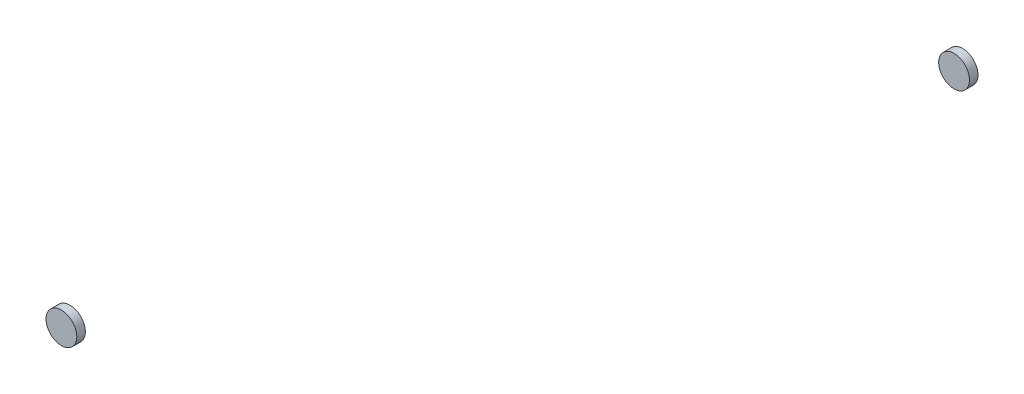
ISO-10303-21;
HEADER;
FILE_DESCRIPTION(('STEP AP214'),'2;1');
FILE_NAME('part.step','',(''),(''),'','','');
FILE_SCHEMA(('AUTOMOTIVE_DESIGN { 1 0 10303 214 1 1 1 1 }'));
ENDSEC;
DATA;
#1=APPLICATION_CONTEXT('core data for automotive mechanical design processes');
#2=APPLICATION_PROTOCOL_DEFINITION('international standard','automotive_design',2000,#1);
#3=PRODUCT_CONTEXT('',#1,'mechanical');
#4=PRODUCT('Part','Part','',(#3));
#5=PRODUCT_RELATED_PRODUCT_CATEGORY('part','',(#4));
#6=PRODUCT_DEFINITION_FORMATION('','',#4);
#7=PRODUCT_DEFINITION_CONTEXT('part definition',#1,'design');
#8=PRODUCT_DEFINITION('design','',#6,#7);
#9=PRODUCT_DEFINITION_SHAPE('','',#8);
#10=(LENGTH_UNIT() NAMED_UNIT(*) SI_UNIT(.MILLI.,.METRE.));
#11=(NAMED_UNIT(*) PLANE_ANGLE_UNIT() SI_UNIT($,.RADIAN.));
#12=(NAMED_UNIT(*) SI_UNIT($,.STERADIAN.) SOLID_ANGLE_UNIT());
#13=UNCERTAINTY_MEASURE_WITH_UNIT(LENGTH_MEASURE(1.E-05),#10,'distance_accuracy_value','');
#14=(GEOMETRIC_REPRESENTATION_CONTEXT(3) GLOBAL_UNCERTAINTY_ASSIGNED_CONTEXT((#13)) GLOBAL_UNIT_ASSIGNED_CONTEXT((#10,
#11,#12)) REPRESENTATION_CONTEXT('',''));
#15=CARTESIAN_POINT('',(0.,0.,0.));
#16=DIRECTION('',(0.,0.,1.));
#17=DIRECTION('',(1.,0.,0.));
#18=AXIS2_PLACEMENT_3D('',#15,#16,#17);
#19=CARTESIAN_POINT('',(4.69719603832977,21.4381646630226,-0.253998923289316));
#20=DIRECTION('',(0.,-8.74227339409095E-08,1.));
#21=DIRECTION('',(-1.19248806384999E-08,-1.,-8.74227339409095E-08));
#22=AXIS2_PLACEMENT_3D('',#19,#20,#21);
#23=PLANE('',#22);
#24=CARTESIAN_POINT('',(4.69719603287772,20.9809646630226,-0.253998963258991));
#25=DIRECTION('',(0.,8.74227339409095E-08,-1.));
#26=DIRECTION('',(1.19248806384999E-08,1.,8.74227339409095E-08));
#27=AXIS2_PLACEMENT_3D('',#24,#25,#26);
#28=CIRCLE('',#27,0.4572);
#29=CARTESIAN_POINT('',(4.69719603832977,21.4381646630226,-0.253998923289317));
#30=VERTEX_POINT('',#29);
#31=EDGE_CURVE('P0_E10',#30,#30,#28,.T.);
#32=ORIENTED_EDGE('',*,*,#31,.T.);
#33=EDGE_LOOP('',(#32));
#34=FACE_BOUND('',#33,.T.);
#35=ADVANCED_FACE('P0_F15',(#34),#23,.F.);
#36=CARTESIAN_POINT('',(4.69719603832977,21.4381646408171,1.07671068285201E-06));
#37=DIRECTION('',(0.,-8.74227339409095E-08,1.));
#38=DIRECTION('',(-1.19248806384999E-08,-1.,-8.74227339409095E-08));
#39=AXIS2_PLACEMENT_3D('',#36,#37,#38);
#40=PLANE('',#39);
#41=CARTESIAN_POINT('',(4.69719603287772,20.9809646408171,1.03674100901396E-06));
#42=DIRECTION('',(0.,8.74227339409095E-08,-1.));
#43=DIRECTION('',(1.19248806384999E-08,1.,8.74227339409095E-08));
#44=AXIS2_PLACEMENT_3D('',#41,#42,#43);
#45=CIRCLE('',#44,0.4572);
#46=CARTESIAN_POINT('',(4.69719603832977,21.4381646408171,1.07671068297175E-06));
#47=VERTEX_POINT('',#46);
#48=EDGE_CURVE('P0_E22',#47,#47,#45,.T.);
#49=ORIENTED_EDGE('',*,*,#48,.F.);
#50=EDGE_LOOP('',(#49));
#51=FACE_BOUND('',#50,.T.);
#52=ADVANCED_FACE('P0_F35',(#51),#40,.T.);
#53=CARTESIAN_POINT('',(4.69719603287772,20.9809646408171,1.03674100901396E-06));
#54=DIRECTION('',(0.,-8.74227339409095E-08,1.));
#55=DIRECTION('',(1.19248806384999E-08,1.,8.74227339409095E-08));
#56=AXIS2_PLACEMENT_3D('',#53,#54,#55);
#57=CYLINDRICAL_SURFACE('',#56,0.4572);
#58=ORIENTED_EDGE('',*,*,#31,.F.);
#59=EDGE_LOOP('',(#58));
#60=FACE_BOUND('',#59,.T.);
#61=ORIENTED_EDGE('',*,*,#48,.T.);
#62=EDGE_LOOP('',(#61));
#63=FACE_BOUND('',#62,.T.);
#64=ADVANCED_FACE('P0_F33',(#60,#63),#57,.T.);
#65=CLOSED_SHELL('',(#35,#52,#64));
#66=MANIFOLD_SOLID_BREP('P0_B1',#65);
#67=CARTESIAN_POINT('',(-22.2599963377325,1.13096622887202,-0.253998963258981));
#68=DIRECTION('',(0.,-8.74227339409092E-08,1.));
#69=DIRECTION('',(1.,-8.74227765734792E-08,0.));
#70=AXIS2_PLACEMENT_3D('',#67,#68,#69);
#71=PLANE('',#70);
#72=CARTESIAN_POINT('',(-21.8027963377325,1.13096618890232,-0.253998963258985));
#73=DIRECTION('',(0.,8.74227339409092E-08,-1.));
#74=DIRECTION('',(-1.,8.74227765734792E-08,0.));
#75=AXIS2_PLACEMENT_3D('',#72,#73,#74);
#76=CIRCLE('',#75,0.4572);
#77=CARTESIAN_POINT('',(-22.2599963377325,1.13096622887202,-0.253998963258982));
#78=VERTEX_POINT('',#77);
#79=EDGE_CURVE('P1_E10',#78,#78,#76,.T.);
#80=ORIENTED_EDGE('',*,*,#79,.T.);
#81=EDGE_LOOP('',(#80));
#82=FACE_BOUND('',#81,.T.);
#83=ADVANCED_FACE('P1_F15',(#82),#71,.F.);
#84=CARTESIAN_POINT('',(-22.2599963377325,1.13096620666664,1.0367410172539E-06));
#85=DIRECTION('',(0.,-8.74227339409092E-08,1.));
#86=DIRECTION('',(1.,-8.74227765734792E-08,0.));
#87=AXIS2_PLACEMENT_3D('',#84,#85,#86);
#88=PLANE('',#87);
#89=CARTESIAN_POINT('',(-21.8027963377325,1.13096616669694,1.03674101378445E-06));
#90=DIRECTION('',(0.,8.74227339409092E-08,-1.));
#91=DIRECTION('',(-1.,8.74227765734792E-08,0.));
#92=AXIS2_PLACEMENT_3D('',#89,#90,#91);
#93=CIRCLE('',#92,0.4572);
#94=CARTESIAN_POINT('',(-22.2599963377325,1.13096620666664,1.03674101727871E-06));
#95=VERTEX_POINT('',#94);
#96=EDGE_CURVE('P1_E22',#95,#95,#93,.T.);
#97=ORIENTED_EDGE('',*,*,#96,.F.);
#98=EDGE_LOOP('',(#97));
#99=FACE_BOUND('',#98,.T.);
#100=ADVANCED_FACE('P1_F35',(#99),#88,.T.);
#101=CARTESIAN_POINT('',(-21.8027963377325,1.13096616669694,1.03674101378445E-06));
#102=DIRECTION('',(0.,-8.74227339409092E-08,1.));
#103=DIRECTION('',(-1.,8.74227765734792E-08,0.));
#104=AXIS2_PLACEMENT_3D('',#101,#102,#103);
#105=CYLINDRICAL_SURFACE('',#104,0.4572);
#106=ORIENTED_EDGE('',*,*,#79,.F.);
#107=EDGE_LOOP('',(#106));
#108=FACE_BOUND('',#107,.T.);
#109=ORIENTED_EDGE('',*,*,#96,.T.);
#110=EDGE_LOOP('',(#109));
#111=FACE_BOUND('',#110,.T.);
#112=ADVANCED_FACE('P1_F33',(#108,#111),#105,.T.);
#113=CLOSED_SHELL('',(#83,#100,#112));
#114=MANIFOLD_SOLID_BREP('P1_B1',#113);
#115=ADVANCED_BREP_SHAPE_REPRESENTATION('',(#18,#66,#114),#14);
#116=SHAPE_DEFINITION_REPRESENTATION(#9,#115);
ENDSEC;
END-ISO-10303-21;
